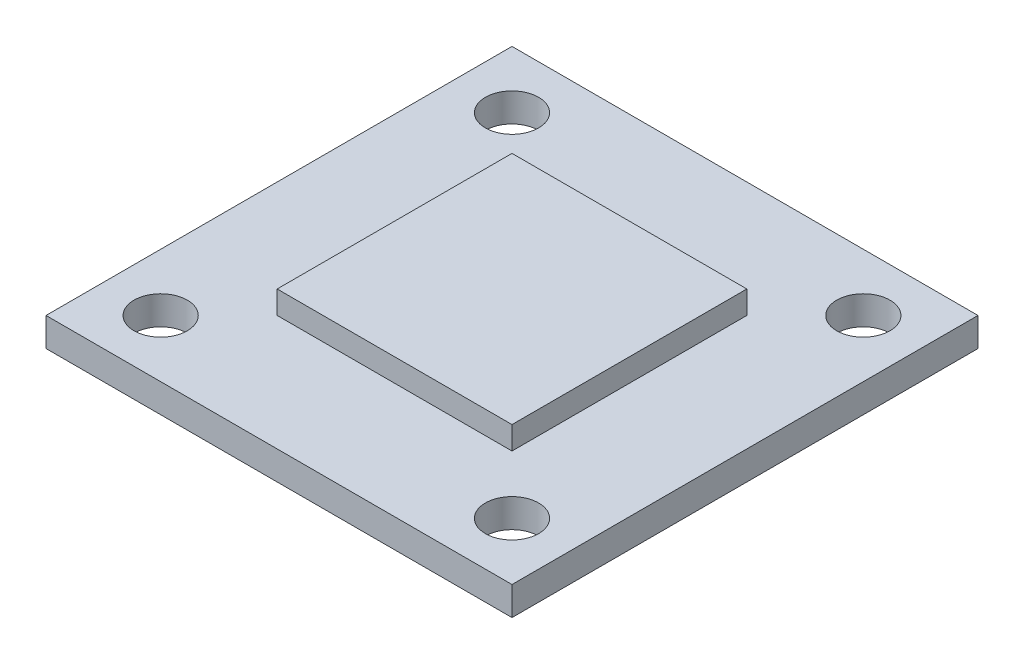
ISO-10303-21;
HEADER;
FILE_DESCRIPTION(('STEP AP214'),'2;1');
FILE_NAME('part.step','',(''),(''),'','','');
FILE_SCHEMA(('AUTOMOTIVE_DESIGN { 1 0 10303 214 1 1 1 1 }'));
ENDSEC;
DATA;
#1=APPLICATION_CONTEXT('core data for automotive mechanical design processes');
#2=APPLICATION_PROTOCOL_DEFINITION('international standard','automotive_design',2000,#1);
#3=PRODUCT_CONTEXT('',#1,'mechanical');
#4=PRODUCT('Part','Part','',(#3));
#5=PRODUCT_RELATED_PRODUCT_CATEGORY('part','',(#4));
#6=PRODUCT_DEFINITION_FORMATION('','',#4);
#7=PRODUCT_DEFINITION_CONTEXT('part definition',#1,'design');
#8=PRODUCT_DEFINITION('design','',#6,#7);
#9=PRODUCT_DEFINITION_SHAPE('','',#8);
#10=(LENGTH_UNIT() NAMED_UNIT(*) SI_UNIT(.MILLI.,.METRE.));
#11=(NAMED_UNIT(*) PLANE_ANGLE_UNIT() SI_UNIT($,.RADIAN.));
#12=(NAMED_UNIT(*) SI_UNIT($,.STERADIAN.) SOLID_ANGLE_UNIT());
#13=UNCERTAINTY_MEASURE_WITH_UNIT(LENGTH_MEASURE(1.E-05),#10,'distance_accuracy_value','');
#14=(GEOMETRIC_REPRESENTATION_CONTEXT(3) GLOBAL_UNCERTAINTY_ASSIGNED_CONTEXT((#13)) GLOBAL_UNIT_ASSIGNED_CONTEXT((#10,
#11,#12)) REPRESENTATION_CONTEXT('',''));
#15=CARTESIAN_POINT('',(0.,0.,0.));
#16=DIRECTION('',(0.,0.,1.));
#17=DIRECTION('',(1.,0.,0.));
#18=AXIS2_PLACEMENT_3D('',#15,#16,#17);
#19=CARTESIAN_POINT('',(0.,1.5875,0.));
#20=DIRECTION('',(0.,-1.,0.));
#21=DIRECTION('',(0.,0.,-1.));
#22=AXIS2_PLACEMENT_3D('',#19,#20,#21);
#23=PLANE('',#22);
#24=CARTESIAN_POINT('',(-9.7282,1.5875,-9.7282));
#25=DIRECTION('',(0.,1.,0.));
#26=DIRECTION('',(0.,0.,1.));
#27=AXIS2_PLACEMENT_3D('',#24,#25,#26);
#28=CIRCLE('',#27,1.4732);
#29=CARTESIAN_POINT('',(-9.7282,1.5875,-8.255));
#30=VERTEX_POINT('',#29);
#31=EDGE_CURVE('E306',#30,#30,#28,.T.);
#32=ORIENTED_EDGE('',*,*,#31,.F.);
#33=EDGE_LOOP('',(#32));
#34=FACE_BOUND('',#33,.T.);
#35=CARTESIAN_POINT('',(-9.7282,1.5875,9.7282));
#36=DIRECTION('',(0.,1.,0.));
#37=DIRECTION('',(0.,0.,1.));
#38=AXIS2_PLACEMENT_3D('',#35,#36,#37);
#39=CIRCLE('',#38,1.4732);
#40=CARTESIAN_POINT('',(-9.7282,1.5875,11.2014));
#41=VERTEX_POINT('',#40);
#42=EDGE_CURVE('E308',#41,#41,#39,.T.);
#43=ORIENTED_EDGE('',*,*,#42,.F.);
#44=EDGE_LOOP('',(#43));
#45=FACE_BOUND('',#44,.T.);
#46=CARTESIAN_POINT('',(9.7282,1.5875,9.7282));
#47=DIRECTION('',(0.,1.,0.));
#48=DIRECTION('',(0.,0.,1.));
#49=AXIS2_PLACEMENT_3D('',#46,#47,#48);
#50=CIRCLE('',#49,1.4732);
#51=CARTESIAN_POINT('',(9.7282,1.5875,11.2014));
#52=VERTEX_POINT('',#51);
#53=EDGE_CURVE('E316',#52,#52,#50,.T.);
#54=ORIENTED_EDGE('',*,*,#53,.F.);
#55=EDGE_LOOP('',(#54));
#56=FACE_BOUND('',#55,.T.);
#57=CARTESIAN_POINT('',(9.7282,1.5875,-9.7282));
#58=DIRECTION('',(0.,1.,0.));
#59=DIRECTION('',(0.,0.,1.));
#60=AXIS2_PLACEMENT_3D('',#57,#58,#59);
#61=CIRCLE('',#60,1.4732);
#62=CARTESIAN_POINT('',(9.7282,1.5875,-8.255));
#63=VERTEX_POINT('',#62);
#64=EDGE_CURVE('E322',#63,#63,#61,.T.);
#65=ORIENTED_EDGE('',*,*,#64,.F.);
#66=EDGE_LOOP('',(#65));
#67=FACE_BOUND('',#66,.T.);
#68=DIRECTION('',(0.,0.,-1.));
#69=VECTOR('',#68,1.);
#70=CARTESIAN_POINT('',(12.9032,1.5875,12.9032));
#71=LINE('',#70,#69);
#72=CARTESIAN_POINT('',(12.9032,1.5875,12.9032));
#73=VERTEX_POINT('',#72);
#74=CARTESIAN_POINT('',(12.9032,1.5875,-12.9032));
#75=VERTEX_POINT('',#74);
#76=EDGE_CURVE('E127',#73,#75,#71,.T.);
#77=ORIENTED_EDGE('',*,*,#76,.T.);
#78=DIRECTION('',(-1.,0.,0.));
#79=VECTOR('',#78,1.);
#80=CARTESIAN_POINT('',(-12.9032,1.5875,-12.9032));
#81=LINE('',#80,#79);
#82=CARTESIAN_POINT('',(-12.9032,1.5875,-12.9032));
#83=VERTEX_POINT('',#82);
#84=EDGE_CURVE('E130',#75,#83,#81,.T.);
#85=ORIENTED_EDGE('',*,*,#84,.T.);
#86=DIRECTION('',(0.,0.,1.));
#87=VECTOR('',#86,1.);
#88=CARTESIAN_POINT('',(-12.9032,1.5875,12.9032));
#89=LINE('',#88,#87);
#90=CARTESIAN_POINT('',(-12.9032,1.5875,12.9032));
#91=VERTEX_POINT('',#90);
#92=EDGE_CURVE('E133',#83,#91,#89,.T.);
#93=ORIENTED_EDGE('',*,*,#92,.T.);
#94=DIRECTION('',(1.,0.,0.));
#95=VECTOR('',#94,1.);
#96=CARTESIAN_POINT('',(-12.9032,1.5875,12.9032));
#97=LINE('',#96,#95);
#98=EDGE_CURVE('E135',#91,#73,#97,.T.);
#99=ORIENTED_EDGE('',*,*,#98,.T.);
#100=EDGE_LOOP('',(#77,#85,#93,#99));
#101=FACE_BOUND('',#100,.T.);
#102=DIRECTION('',(0.,0.,-1.));
#103=VECTOR('',#102,1.);
#104=CARTESIAN_POINT('',(6.5024,1.5875,6.5024));
#105=LINE('',#104,#103);
#106=CARTESIAN_POINT('',(6.5024,1.5875,6.5024));
#107=VERTEX_POINT('',#106);
#108=CARTESIAN_POINT('',(6.5024,1.5875,-6.5024));
#109=VERTEX_POINT('',#108);
#110=EDGE_CURVE('E48',#107,#109,#105,.T.);
#111=ORIENTED_EDGE('',*,*,#110,.F.);
#112=DIRECTION('',(1.,0.,0.));
#113=VECTOR('',#112,1.);
#114=CARTESIAN_POINT('',(-6.5024,1.5875,6.5024));
#115=LINE('',#114,#113);
#116=CARTESIAN_POINT('',(-6.5024,1.5875,6.5024));
#117=VERTEX_POINT('',#116);
#118=EDGE_CURVE('E52',#117,#107,#115,.T.);
#119=ORIENTED_EDGE('',*,*,#118,.F.);
#120=DIRECTION('',(0.,0.,1.));
#121=VECTOR('',#120,1.);
#122=CARTESIAN_POINT('',(-6.5024,1.5875,6.5024));
#123=LINE('',#122,#121);
#124=CARTESIAN_POINT('',(-6.5024,1.5875,-6.5024));
#125=VERTEX_POINT('',#124);
#126=EDGE_CURVE('E334',#125,#117,#123,.T.);
#127=ORIENTED_EDGE('',*,*,#126,.F.);
#128=DIRECTION('',(-1.,0.,0.));
#129=VECTOR('',#128,1.);
#130=CARTESIAN_POINT('',(-6.5024,1.5875,-6.5024));
#131=LINE('',#130,#129);
#132=EDGE_CURVE('E332',#109,#125,#131,.T.);
#133=ORIENTED_EDGE('',*,*,#132,.F.);
#134=EDGE_LOOP('',(#111,#119,#127,#133));
#135=FACE_BOUND('',#134,.T.);
#136=ADVANCED_FACE('F33',(#34,#45,#56,#67,#101,#135),#23,.F.);
#137=CARTESIAN_POINT('',(12.9032,1.5875,12.9032));
#138=DIRECTION('',(-1.,0.,0.));
#139=DIRECTION('',(0.,0.,1.));
#140=AXIS2_PLACEMENT_3D('',#137,#138,#139);
#141=PLANE('',#140);
#142=DIRECTION('',(0.,0.,-1.));
#143=VECTOR('',#142,1.);
#144=CARTESIAN_POINT('',(12.9032,0.,12.9032));
#145=LINE('',#144,#143);
#146=CARTESIAN_POINT('',(12.9032,0.,12.9032));
#147=VERTEX_POINT('',#146);
#148=CARTESIAN_POINT('',(12.9032,0.,-12.9032));
#149=VERTEX_POINT('',#148);
#150=EDGE_CURVE('E118',#147,#149,#145,.T.);
#151=ORIENTED_EDGE('',*,*,#150,.T.);
#152=DIRECTION('',(0.,-1.,0.));
#153=VECTOR('',#152,1.);
#154=CARTESIAN_POINT('',(12.9032,1.5875,-12.9032));
#155=LINE('',#154,#153);
#156=EDGE_CURVE('E11',#75,#149,#155,.T.);
#157=ORIENTED_EDGE('',*,*,#156,.F.);
#158=ORIENTED_EDGE('',*,*,#76,.F.);
#159=DIRECTION('',(0.,-1.,0.));
#160=VECTOR('',#159,1.);
#161=CARTESIAN_POINT('',(12.9032,1.5875,12.9032));
#162=LINE('',#161,#160);
#163=EDGE_CURVE('E136',#73,#147,#162,.T.);
#164=ORIENTED_EDGE('',*,*,#163,.T.);
#165=EDGE_LOOP('',(#151,#157,#158,#164));
#166=FACE_BOUND('',#165,.T.);
#167=ADVANCED_FACE('F35',(#166),#141,.F.);
#168=CARTESIAN_POINT('',(-12.9032,1.5875,-12.9032));
#169=DIRECTION('',(0.,0.,1.));
#170=DIRECTION('',(1.,0.,0.));
#171=AXIS2_PLACEMENT_3D('',#168,#169,#170);
#172=PLANE('',#171);
#173=DIRECTION('',(-1.,0.,0.));
#174=VECTOR('',#173,1.);
#175=CARTESIAN_POINT('',(-12.9032,0.,-12.9032));
#176=LINE('',#175,#174);
#177=CARTESIAN_POINT('',(-12.9032,0.,-12.9032));
#178=VERTEX_POINT('',#177);
#179=EDGE_CURVE('E121',#149,#178,#176,.T.);
#180=ORIENTED_EDGE('',*,*,#179,.T.);
#181=DIRECTION('',(0.,-1.,0.));
#182=VECTOR('',#181,1.);
#183=CARTESIAN_POINT('',(-12.9032,1.5875,-12.9032));
#184=LINE('',#183,#182);
#185=EDGE_CURVE('E41',#83,#178,#184,.T.);
#186=ORIENTED_EDGE('',*,*,#185,.F.);
#187=ORIENTED_EDGE('',*,*,#84,.F.);
#188=ORIENTED_EDGE('',*,*,#156,.T.);
#189=EDGE_LOOP('',(#180,#186,#187,#188));
#190=FACE_BOUND('',#189,.T.);
#191=ADVANCED_FACE('F166',(#190),#172,.F.);
#192=CARTESIAN_POINT('',(-12.9032,1.5875,12.9032));
#193=DIRECTION('',(1.,0.,0.));
#194=DIRECTION('',(0.,0.,-1.));
#195=AXIS2_PLACEMENT_3D('',#192,#193,#194);
#196=PLANE('',#195);
#197=DIRECTION('',(0.,0.,1.));
#198=VECTOR('',#197,1.);
#199=CARTESIAN_POINT('',(-12.9032,0.,12.9032));
#200=LINE('',#199,#198);
#201=CARTESIAN_POINT('',(-12.9032,0.,12.9032));
#202=VERTEX_POINT('',#201);
#203=EDGE_CURVE('E139',#178,#202,#200,.T.);
#204=ORIENTED_EDGE('',*,*,#203,.T.);
#205=DIRECTION('',(0.,-1.,0.));
#206=VECTOR('',#205,1.);
#207=CARTESIAN_POINT('',(-12.9032,1.5875,12.9032));
#208=LINE('',#207,#206);
#209=EDGE_CURVE('E144',#91,#202,#208,.T.);
#210=ORIENTED_EDGE('',*,*,#209,.F.);
#211=ORIENTED_EDGE('',*,*,#92,.F.);
#212=ORIENTED_EDGE('',*,*,#185,.T.);
#213=EDGE_LOOP('',(#204,#210,#211,#212));
#214=FACE_BOUND('',#213,.T.);
#215=ADVANCED_FACE('F151',(#214),#196,.F.);
#216=CARTESIAN_POINT('',(-12.9032,1.5875,12.9032));
#217=DIRECTION('',(0.,0.,-1.));
#218=DIRECTION('',(-1.,0.,0.));
#219=AXIS2_PLACEMENT_3D('',#216,#217,#218);
#220=PLANE('',#219);
#221=DIRECTION('',(1.,0.,0.));
#222=VECTOR('',#221,1.);
#223=CARTESIAN_POINT('',(-12.9032,0.,12.9032));
#224=LINE('',#223,#222);
#225=EDGE_CURVE('E131',#202,#147,#224,.T.);
#226=ORIENTED_EDGE('',*,*,#225,.T.);
#227=ORIENTED_EDGE('',*,*,#163,.F.);
#228=ORIENTED_EDGE('',*,*,#98,.F.);
#229=ORIENTED_EDGE('',*,*,#209,.T.);
#230=EDGE_LOOP('',(#226,#227,#228,#229));
#231=FACE_BOUND('',#230,.T.);
#232=ADVANCED_FACE('F160',(#231),#220,.F.);
#233=CARTESIAN_POINT('',(0.,0.,0.));
#234=DIRECTION('',(0.,-1.,0.));
#235=DIRECTION('',(0.,0.,-1.));
#236=AXIS2_PLACEMENT_3D('',#233,#234,#235);
#237=PLANE('',#236);
#238=CARTESIAN_POINT('',(-9.7282,0.,-9.7282));
#239=DIRECTION('',(0.,1.,0.));
#240=DIRECTION('',(0.,0.,1.));
#241=AXIS2_PLACEMENT_3D('',#238,#239,#240);
#242=CIRCLE('',#241,1.4732);
#243=CARTESIAN_POINT('',(-9.7282,0.,-8.255));
#244=VERTEX_POINT('',#243);
#245=EDGE_CURVE('E304',#244,#244,#242,.T.);
#246=ORIENTED_EDGE('',*,*,#245,.T.);
#247=EDGE_LOOP('',(#246));
#248=FACE_BOUND('',#247,.T.);
#249=CARTESIAN_POINT('',(-9.7282,0.,9.7282));
#250=DIRECTION('',(0.,1.,0.));
#251=DIRECTION('',(0.,0.,1.));
#252=AXIS2_PLACEMENT_3D('',#249,#250,#251);
#253=CIRCLE('',#252,1.4732);
#254=CARTESIAN_POINT('',(-9.7282,0.,11.2014));
#255=VERTEX_POINT('',#254);
#256=EDGE_CURVE('E313',#255,#255,#253,.T.);
#257=ORIENTED_EDGE('',*,*,#256,.T.);
#258=EDGE_LOOP('',(#257));
#259=FACE_BOUND('',#258,.T.);
#260=CARTESIAN_POINT('',(9.7282,0.,9.7282));
#261=DIRECTION('',(0.,1.,0.));
#262=DIRECTION('',(0.,0.,1.));
#263=AXIS2_PLACEMENT_3D('',#260,#261,#262);
#264=CIRCLE('',#263,1.4732);
#265=CARTESIAN_POINT('',(9.7282,0.,11.2014));
#266=VERTEX_POINT('',#265);
#267=EDGE_CURVE('E319',#266,#266,#264,.T.);
#268=ORIENTED_EDGE('',*,*,#267,.T.);
#269=EDGE_LOOP('',(#268));
#270=FACE_BOUND('',#269,.T.);
#271=CARTESIAN_POINT('',(9.7282,0.,-9.7282));
#272=DIRECTION('',(0.,1.,0.));
#273=DIRECTION('',(0.,0.,1.));
#274=AXIS2_PLACEMENT_3D('',#271,#272,#273);
#275=CIRCLE('',#274,1.4732);
#276=CARTESIAN_POINT('',(9.7282,0.,-8.255));
#277=VERTEX_POINT('',#276);
#278=EDGE_CURVE('E325',#277,#277,#275,.T.);
#279=ORIENTED_EDGE('',*,*,#278,.T.);
#280=EDGE_LOOP('',(#279));
#281=FACE_BOUND('',#280,.T.);
#282=ORIENTED_EDGE('',*,*,#150,.F.);
#283=ORIENTED_EDGE('',*,*,#225,.F.);
#284=ORIENTED_EDGE('',*,*,#203,.F.);
#285=ORIENTED_EDGE('',*,*,#179,.F.);
#286=EDGE_LOOP('',(#282,#283,#284,#285));
#287=FACE_BOUND('',#286,.T.);
#288=ADVANCED_FACE('F157',(#248,#259,#270,#281,#287),#237,.T.);
#289=CARTESIAN_POINT('',(6.5024,2.8575,6.5024));
#290=DIRECTION('',(-1.,0.,0.));
#291=DIRECTION('',(0.,0.,1.));
#292=AXIS2_PLACEMENT_3D('',#289,#290,#291);
#293=PLANE('',#292);
#294=ORIENTED_EDGE('',*,*,#110,.T.);
#295=DIRECTION('',(0.,-1.,0.));
#296=VECTOR('',#295,1.);
#297=CARTESIAN_POINT('',(6.5024,2.8575,-6.5024));
#298=LINE('',#297,#296);
#299=CARTESIAN_POINT('',(6.5024,2.8575,-6.5024));
#300=VERTEX_POINT('',#299);
#301=EDGE_CURVE('E101',#300,#109,#298,.T.);
#302=ORIENTED_EDGE('',*,*,#301,.F.);
#303=DIRECTION('',(0.,0.,-1.));
#304=VECTOR('',#303,1.);
#305=CARTESIAN_POINT('',(6.5024,2.8575,6.5024));
#306=LINE('',#305,#304);
#307=CARTESIAN_POINT('',(6.5024,2.8575,6.5024));
#308=VERTEX_POINT('',#307);
#309=EDGE_CURVE('E107',#308,#300,#306,.T.);
#310=ORIENTED_EDGE('',*,*,#309,.F.);
#311=DIRECTION('',(0.,-1.,0.));
#312=VECTOR('',#311,1.);
#313=CARTESIAN_POINT('',(6.5024,2.8575,6.5024));
#314=LINE('',#313,#312);
#315=EDGE_CURVE('E330',#308,#107,#314,.T.);
#316=ORIENTED_EDGE('',*,*,#315,.T.);
#317=EDGE_LOOP('',(#294,#302,#310,#316));
#318=FACE_BOUND('',#317,.T.);
#319=ADVANCED_FACE('F117',(#318),#293,.F.);
#320=CARTESIAN_POINT('',(-6.5024,2.8575,-6.5024));
#321=DIRECTION('',(0.,0.,1.));
#322=DIRECTION('',(1.,0.,0.));
#323=AXIS2_PLACEMENT_3D('',#320,#321,#322);
#324=PLANE('',#323);
#325=ORIENTED_EDGE('',*,*,#132,.T.);
#326=DIRECTION('',(0.,-1.,0.));
#327=VECTOR('',#326,1.);
#328=CARTESIAN_POINT('',(-6.5024,2.8575,-6.5024));
#329=LINE('',#328,#327);
#330=CARTESIAN_POINT('',(-6.5024,2.8575,-6.5024));
#331=VERTEX_POINT('',#330);
#332=EDGE_CURVE('E103',#331,#125,#329,.T.);
#333=ORIENTED_EDGE('',*,*,#332,.F.);
#334=DIRECTION('',(-1.,0.,0.));
#335=VECTOR('',#334,1.);
#336=CARTESIAN_POINT('',(-6.5024,2.8575,-6.5024));
#337=LINE('',#336,#335);
#338=EDGE_CURVE('E96',#300,#331,#337,.T.);
#339=ORIENTED_EDGE('',*,*,#338,.F.);
#340=ORIENTED_EDGE('',*,*,#301,.T.);
#341=EDGE_LOOP('',(#325,#333,#339,#340));
#342=FACE_BOUND('',#341,.T.);
#343=ADVANCED_FACE('F99',(#342),#324,.F.);
#344=CARTESIAN_POINT('',(-6.5024,2.8575,6.5024));
#345=DIRECTION('',(1.,0.,0.));
#346=DIRECTION('',(0.,0.,-1.));
#347=AXIS2_PLACEMENT_3D('',#344,#345,#346);
#348=PLANE('',#347);
#349=ORIENTED_EDGE('',*,*,#126,.T.);
#350=DIRECTION('',(0.,-1.,0.));
#351=VECTOR('',#350,1.);
#352=CARTESIAN_POINT('',(-6.5024,2.8575,6.5024));
#353=LINE('',#352,#351);
#354=CARTESIAN_POINT('',(-6.5024,2.8575,6.5024));
#355=VERTEX_POINT('',#354);
#356=EDGE_CURVE('E123',#355,#117,#353,.T.);
#357=ORIENTED_EDGE('',*,*,#356,.F.);
#358=DIRECTION('',(0.,0.,1.));
#359=VECTOR('',#358,1.);
#360=CARTESIAN_POINT('',(-6.5024,2.8575,6.5024));
#361=LINE('',#360,#359);
#362=EDGE_CURVE('E106',#331,#355,#361,.T.);
#363=ORIENTED_EDGE('',*,*,#362,.F.);
#364=ORIENTED_EDGE('',*,*,#332,.T.);
#365=EDGE_LOOP('',(#349,#357,#363,#364));
#366=FACE_BOUND('',#365,.T.);
#367=ADVANCED_FACE('F207',(#366),#348,.F.);
#368=CARTESIAN_POINT('',(-6.5024,2.8575,6.5024));
#369=DIRECTION('',(0.,0.,-1.));
#370=DIRECTION('',(-1.,0.,0.));
#371=AXIS2_PLACEMENT_3D('',#368,#369,#370);
#372=PLANE('',#371);
#373=ORIENTED_EDGE('',*,*,#118,.T.);
#374=ORIENTED_EDGE('',*,*,#315,.F.);
#375=DIRECTION('',(1.,0.,0.));
#376=VECTOR('',#375,1.);
#377=CARTESIAN_POINT('',(-6.5024,2.8575,6.5024));
#378=LINE('',#377,#376);
#379=EDGE_CURVE('E112',#355,#308,#378,.T.);
#380=ORIENTED_EDGE('',*,*,#379,.F.);
#381=ORIENTED_EDGE('',*,*,#356,.T.);
#382=EDGE_LOOP('',(#373,#374,#380,#381));
#383=FACE_BOUND('',#382,.T.);
#384=ADVANCED_FACE('F213',(#383),#372,.F.);
#385=CARTESIAN_POINT('',(0.,2.8575,0.));
#386=DIRECTION('',(0.,-1.,0.));
#387=DIRECTION('',(0.,0.,-1.));
#388=AXIS2_PLACEMENT_3D('',#385,#386,#387);
#389=PLANE('',#388);
#390=ORIENTED_EDGE('',*,*,#309,.T.);
#391=ORIENTED_EDGE('',*,*,#338,.T.);
#392=ORIENTED_EDGE('',*,*,#362,.T.);
#393=ORIENTED_EDGE('',*,*,#379,.T.);
#394=EDGE_LOOP('',(#390,#391,#392,#393));
#395=FACE_BOUND('',#394,.T.);
#396=ADVANCED_FACE('F110',(#395),#389,.F.);
#397=CARTESIAN_POINT('',(9.7282,1.5875,-9.7282));
#398=DIRECTION('',(0.,1.,0.));
#399=DIRECTION('',(0.,0.,1.));
#400=AXIS2_PLACEMENT_3D('',#397,#398,#399);
#401=CYLINDRICAL_SURFACE('',#400,1.4732);
#402=ORIENTED_EDGE('',*,*,#278,.F.);
#403=EDGE_LOOP('',(#402));
#404=FACE_BOUND('',#403,.T.);
#405=ORIENTED_EDGE('',*,*,#64,.T.);
#406=EDGE_LOOP('',(#405));
#407=FACE_BOUND('',#406,.T.);
#408=ADVANCED_FACE('F228',(#404,#407),#401,.F.);
#409=CARTESIAN_POINT('',(9.7282,1.5875,9.7282));
#410=DIRECTION('',(0.,1.,0.));
#411=DIRECTION('',(0.,0.,1.));
#412=AXIS2_PLACEMENT_3D('',#409,#410,#411);
#413=CYLINDRICAL_SURFACE('',#412,1.4732);
#414=ORIENTED_EDGE('',*,*,#267,.F.);
#415=EDGE_LOOP('',(#414));
#416=FACE_BOUND('',#415,.T.);
#417=ORIENTED_EDGE('',*,*,#53,.T.);
#418=EDGE_LOOP('',(#417));
#419=FACE_BOUND('',#418,.T.);
#420=ADVANCED_FACE('F234',(#416,#419),#413,.F.);
#421=CARTESIAN_POINT('',(-9.7282,1.5875,9.7282));
#422=DIRECTION('',(0.,1.,0.));
#423=DIRECTION('',(0.,0.,1.));
#424=AXIS2_PLACEMENT_3D('',#421,#422,#423);
#425=CYLINDRICAL_SURFACE('',#424,1.4732);
#426=ORIENTED_EDGE('',*,*,#256,.F.);
#427=EDGE_LOOP('',(#426));
#428=FACE_BOUND('',#427,.T.);
#429=ORIENTED_EDGE('',*,*,#42,.T.);
#430=EDGE_LOOP('',(#429));
#431=FACE_BOUND('',#430,.T.);
#432=ADVANCED_FACE('F242',(#428,#431),#425,.F.);
#433=CARTESIAN_POINT('',(-9.7282,1.5875,-9.7282));
#434=DIRECTION('',(0.,1.,0.));
#435=DIRECTION('',(0.,0.,1.));
#436=AXIS2_PLACEMENT_3D('',#433,#434,#435);
#437=CYLINDRICAL_SURFACE('',#436,1.4732);
#438=ORIENTED_EDGE('',*,*,#245,.F.);
#439=EDGE_LOOP('',(#438));
#440=FACE_BOUND('',#439,.T.);
#441=ORIENTED_EDGE('',*,*,#31,.T.);
#442=EDGE_LOOP('',(#441));
#443=FACE_BOUND('',#442,.T.);
#444=ADVANCED_FACE('F250',(#440,#443),#437,.F.);
#445=CLOSED_SHELL('',(#136,#167,#191,#215,#232,#288,#319,#343,#367,#384,#396,#408,#420,#432,#444));
#446=MANIFOLD_SOLID_BREP('B2',#445);
#447=ADVANCED_BREP_SHAPE_REPRESENTATION('',(#18,#446),#14);
#448=SHAPE_DEFINITION_REPRESENTATION(#9,#447);
ENDSEC;
END-ISO-10303-21;
